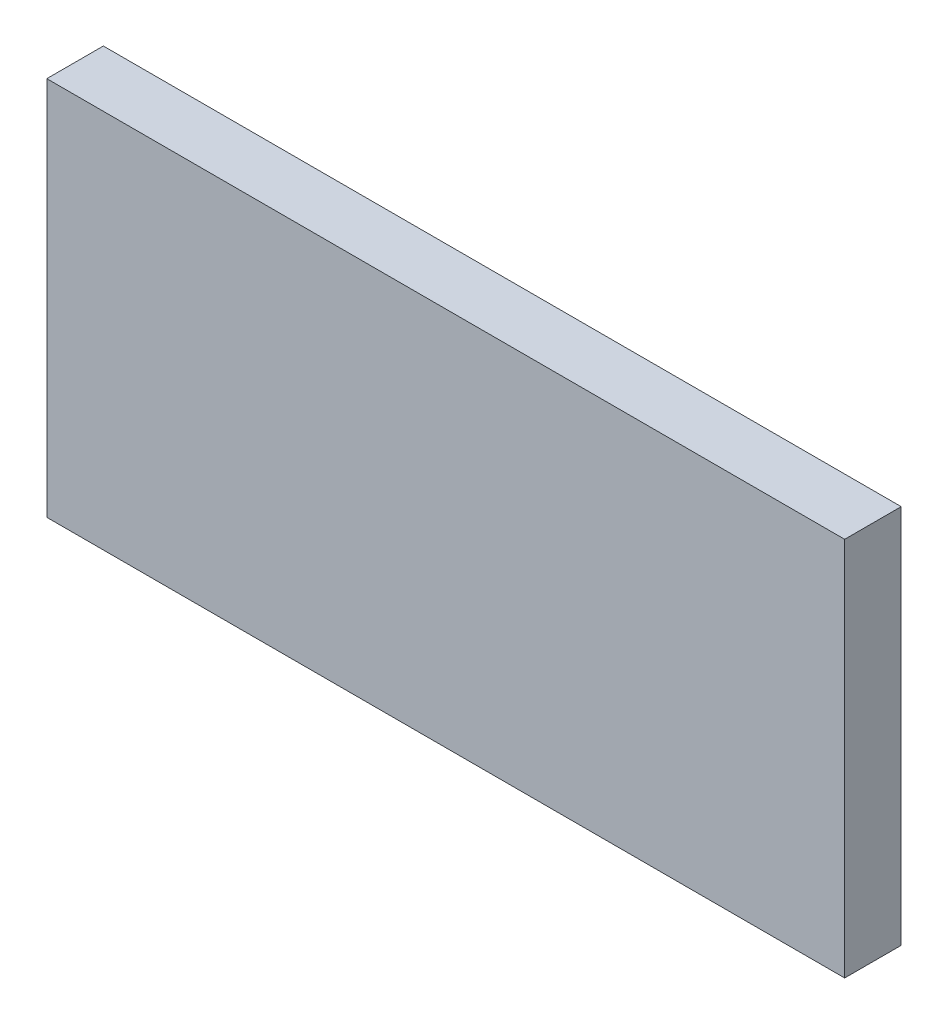
ISO-10303-21;
HEADER;
FILE_DESCRIPTION(('STEP AP214'),'2;1');
FILE_NAME('part.step','',(''),(''),'','','');
FILE_SCHEMA(('AUTOMOTIVE_DESIGN { 1 0 10303 214 1 1 1 1 }'));
ENDSEC;
DATA;
#1=APPLICATION_CONTEXT('core data for automotive mechanical design processes');
#2=APPLICATION_PROTOCOL_DEFINITION('international standard','automotive_design',2000,#1);
#3=PRODUCT_CONTEXT('',#1,'mechanical');
#4=PRODUCT('Part','Part','',(#3));
#5=PRODUCT_RELATED_PRODUCT_CATEGORY('part','',(#4));
#6=PRODUCT_DEFINITION_FORMATION('','',#4);
#7=PRODUCT_DEFINITION_CONTEXT('part definition',#1,'design');
#8=PRODUCT_DEFINITION('design','',#6,#7);
#9=PRODUCT_DEFINITION_SHAPE('','',#8);
#10=(LENGTH_UNIT() NAMED_UNIT(*) SI_UNIT(.MILLI.,.METRE.));
#11=(NAMED_UNIT(*) PLANE_ANGLE_UNIT() SI_UNIT($,.RADIAN.));
#12=(NAMED_UNIT(*) SI_UNIT($,.STERADIAN.) SOLID_ANGLE_UNIT());
#13=UNCERTAINTY_MEASURE_WITH_UNIT(LENGTH_MEASURE(1.E-05),#10,'distance_accuracy_value','');
#14=(GEOMETRIC_REPRESENTATION_CONTEXT(3) GLOBAL_UNCERTAINTY_ASSIGNED_CONTEXT((#13)) GLOBAL_UNIT_ASSIGNED_CONTEXT((#10,
#11,#12)) REPRESENTATION_CONTEXT('',''));
#15=CARTESIAN_POINT('',(0.,0.,0.));
#16=DIRECTION('',(0.,0.,1.));
#17=DIRECTION('',(1.,0.,0.));
#18=AXIS2_PLACEMENT_3D('',#15,#16,#17);
#19=CARTESIAN_POINT('',(33.3375,-0.00999999999999889,2.3722));
#20=DIRECTION('',(1.,0.,0.));
#21=DIRECTION('',(0.,0.,-1.));
#22=AXIS2_PLACEMENT_3D('',#19,#20,#21);
#23=PLANE('',#22);
#24=DIRECTION('',(0.,-1.,0.));
#25=VECTOR('',#24,1.);
#26=CARTESIAN_POINT('',(33.3375,7.93749999999999,0.));
#27=LINE('',#26,#25);
#28=CARTESIAN_POINT('',(33.3375,15.875,0.));
#29=VERTEX_POINT('',#28);
#30=CARTESIAN_POINT('',(33.3375,0.,0.));
#31=VERTEX_POINT('',#30);
#32=EDGE_CURVE('E69',#29,#31,#27,.T.);
#33=ORIENTED_EDGE('',*,*,#32,.F.);
#34=DIRECTION('',(0.,0.,-1.));
#35=VECTOR('',#34,1.);
#36=CARTESIAN_POINT('',(33.3375,15.875,1.1811));
#37=LINE('',#36,#35);
#38=CARTESIAN_POINT('',(33.3375,15.875,2.3622));
#39=VERTEX_POINT('',#38);
#40=EDGE_CURVE('E56',#39,#29,#37,.T.);
#41=ORIENTED_EDGE('',*,*,#40,.F.);
#42=DIRECTION('',(0.,1.,0.));
#43=VECTOR('',#42,1.);
#44=CARTESIAN_POINT('',(33.3375,7.93749999999999,2.3622));
#45=LINE('',#44,#43);
#46=CARTESIAN_POINT('',(33.3375,0.,2.3622));
#47=VERTEX_POINT('',#46);
#48=EDGE_CURVE('E21',#47,#39,#45,.T.);
#49=ORIENTED_EDGE('',*,*,#48,.F.);
#50=DIRECTION('',(0.,0.,1.));
#51=VECTOR('',#50,1.);
#52=CARTESIAN_POINT('',(33.3375,0.,1.1811));
#53=LINE('',#52,#51);
#54=EDGE_CURVE('E82',#31,#47,#53,.T.);
#55=ORIENTED_EDGE('',*,*,#54,.F.);
#56=EDGE_LOOP('',(#33,#41,#49,#55));
#57=FACE_BOUND('',#56,.T.);
#58=ADVANCED_FACE('F17',(#57),#23,.T.);
#59=CARTESIAN_POINT('',(-0.0100000000000033,-0.01,2.3622));
#60=DIRECTION('',(0.,0.,1.));
#61=DIRECTION('',(1.,0.,0.));
#62=AXIS2_PLACEMENT_3D('',#59,#60,#61);
#63=PLANE('',#62);
#64=ORIENTED_EDGE('',*,*,#48,.T.);
#65=DIRECTION('',(1.,0.,0.));
#66=VECTOR('',#65,1.);
#67=CARTESIAN_POINT('',(16.66875,15.875,2.3622));
#68=LINE('',#67,#66);
#69=CARTESIAN_POINT('',(0.,15.875,2.3622));
#70=VERTEX_POINT('',#69);
#71=EDGE_CURVE('E62',#70,#39,#68,.T.);
#72=ORIENTED_EDGE('',*,*,#71,.F.);
#73=DIRECTION('',(0.,1.,0.));
#74=VECTOR('',#73,1.);
#75=CARTESIAN_POINT('',(0.,7.93749999999999,2.3622));
#76=LINE('',#75,#74);
#77=CARTESIAN_POINT('',(0.,0.,2.3622));
#78=VERTEX_POINT('',#77);
#79=EDGE_CURVE('E84',#78,#70,#76,.T.);
#80=ORIENTED_EDGE('',*,*,#79,.F.);
#81=DIRECTION('',(-1.,0.,0.));
#82=VECTOR('',#81,1.);
#83=CARTESIAN_POINT('',(16.66875,0.,2.3622));
#84=LINE('',#83,#82);
#85=EDGE_CURVE('E65',#47,#78,#84,.T.);
#86=ORIENTED_EDGE('',*,*,#85,.F.);
#87=EDGE_LOOP('',(#64,#72,#80,#86));
#88=FACE_BOUND('',#87,.T.);
#89=ADVANCED_FACE('F61',(#88),#63,.T.);
#90=CARTESIAN_POINT('',(-0.0100000000000049,15.875,-0.01));
#91=DIRECTION('',(0.,1.,0.));
#92=DIRECTION('',(0.,0.,1.));
#93=AXIS2_PLACEMENT_3D('',#90,#91,#92);
#94=PLANE('',#93);
#95=DIRECTION('',(1.,0.,0.));
#96=VECTOR('',#95,1.);
#97=CARTESIAN_POINT('',(16.66875,15.875,0.));
#98=LINE('',#97,#96);
#99=CARTESIAN_POINT('',(0.,15.875,0.));
#100=VERTEX_POINT('',#99);
#101=EDGE_CURVE('E71',#100,#29,#98,.T.);
#102=ORIENTED_EDGE('',*,*,#101,.F.);
#103=DIRECTION('',(0.,0.,-1.));
#104=VECTOR('',#103,1.);
#105=CARTESIAN_POINT('',(0.,15.875,1.1811));
#106=LINE('',#105,#104);
#107=EDGE_CURVE('E75',#70,#100,#106,.T.);
#108=ORIENTED_EDGE('',*,*,#107,.F.);
#109=ORIENTED_EDGE('',*,*,#71,.T.);
#110=ORIENTED_EDGE('',*,*,#40,.T.);
#111=EDGE_LOOP('',(#102,#108,#109,#110));
#112=FACE_BOUND('',#111,.T.);
#113=ADVANCED_FACE('F73',(#112),#94,.T.);
#114=CARTESIAN_POINT('',(33.3475,-0.01,0.));
#115=DIRECTION('',(0.,0.,-1.));
#116=DIRECTION('',(-1.,0.,0.));
#117=AXIS2_PLACEMENT_3D('',#114,#115,#116);
#118=PLANE('',#117);
#119=ORIENTED_EDGE('',*,*,#101,.T.);
#120=ORIENTED_EDGE('',*,*,#32,.T.);
#121=DIRECTION('',(1.,0.,0.));
#122=VECTOR('',#121,1.);
#123=CARTESIAN_POINT('',(16.66875,0.,0.));
#124=LINE('',#123,#122);
#125=CARTESIAN_POINT('',(0.,0.,0.));
#126=VERTEX_POINT('',#125);
#127=EDGE_CURVE('E36',#126,#31,#124,.T.);
#128=ORIENTED_EDGE('',*,*,#127,.F.);
#129=DIRECTION('',(0.,-1.,0.));
#130=VECTOR('',#129,1.);
#131=CARTESIAN_POINT('',(0.,7.93749999999999,0.));
#132=LINE('',#131,#130);
#133=EDGE_CURVE('E27',#100,#126,#132,.T.);
#134=ORIENTED_EDGE('',*,*,#133,.F.);
#135=EDGE_LOOP('',(#119,#120,#128,#134));
#136=FACE_BOUND('',#135,.T.);
#137=ADVANCED_FACE('F89',(#136),#118,.T.);
#138=CARTESIAN_POINT('',(-0.00999999999999889,0.,2.3722));
#139=DIRECTION('',(0.,-1.,0.));
#140=DIRECTION('',(0.,0.,-1.));
#141=AXIS2_PLACEMENT_3D('',#138,#139,#140);
#142=PLANE('',#141);
#143=ORIENTED_EDGE('',*,*,#127,.T.);
#144=ORIENTED_EDGE('',*,*,#54,.T.);
#145=ORIENTED_EDGE('',*,*,#85,.T.);
#146=DIRECTION('',(0.,0.,1.));
#147=VECTOR('',#146,1.);
#148=CARTESIAN_POINT('',(0.,0.,1.1811));
#149=LINE('',#148,#147);
#150=EDGE_CURVE('E11',#126,#78,#149,.T.);
#151=ORIENTED_EDGE('',*,*,#150,.F.);
#152=EDGE_LOOP('',(#143,#144,#145,#151));
#153=FACE_BOUND('',#152,.T.);
#154=ADVANCED_FACE('F91',(#153),#142,.T.);
#155=CARTESIAN_POINT('',(0.,-0.01,-0.01));
#156=DIRECTION('',(-1.,0.,0.));
#157=DIRECTION('',(0.,0.,1.));
#158=AXIS2_PLACEMENT_3D('',#155,#156,#157);
#159=PLANE('',#158);
#160=ORIENTED_EDGE('',*,*,#133,.T.);
#161=ORIENTED_EDGE('',*,*,#150,.T.);
#162=ORIENTED_EDGE('',*,*,#79,.T.);
#163=ORIENTED_EDGE('',*,*,#107,.T.);
#164=EDGE_LOOP('',(#160,#161,#162,#163));
#165=FACE_BOUND('',#164,.T.);
#166=ADVANCED_FACE('F19',(#165),#159,.T.);
#167=CLOSED_SHELL('',(#58,#89,#113,#137,#154,#166));
#168=MANIFOLD_SOLID_BREP('B1',#167);
#169=ADVANCED_BREP_SHAPE_REPRESENTATION('',(#18,#168),#14);
#170=SHAPE_DEFINITION_REPRESENTATION(#9,#169);
ENDSEC;
END-ISO-10303-21;
